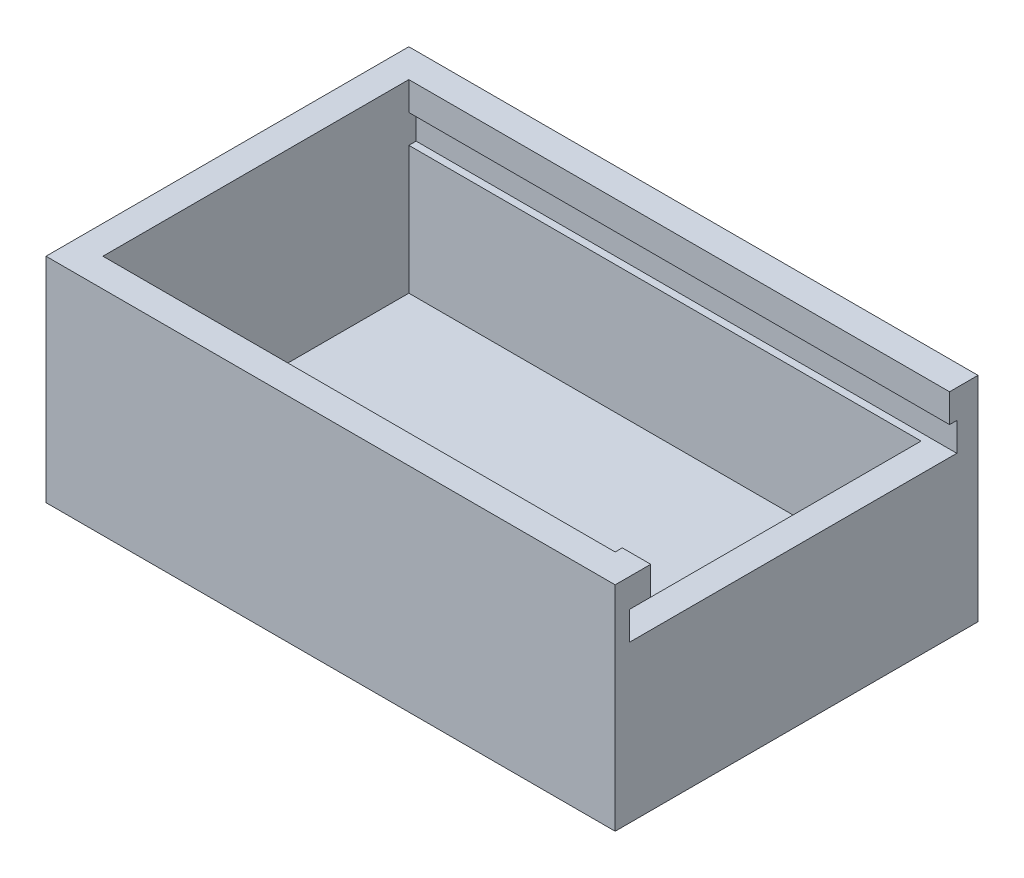
ISO-10303-21;
HEADER;
FILE_DESCRIPTION(('STEP AP214'),'2;1');
FILE_NAME('part.step','',(''),(''),'','','');
FILE_SCHEMA(('AUTOMOTIVE_DESIGN { 1 0 10303 214 1 1 1 1 }'));
ENDSEC;
DATA;
#1=APPLICATION_CONTEXT('core data for automotive mechanical design processes');
#2=APPLICATION_PROTOCOL_DEFINITION('international standard','automotive_design',2000,#1);
#3=PRODUCT_CONTEXT('',#1,'mechanical');
#4=PRODUCT('Part','Part','',(#3));
#5=PRODUCT_RELATED_PRODUCT_CATEGORY('part','',(#4));
#6=PRODUCT_DEFINITION_FORMATION('','',#4);
#7=PRODUCT_DEFINITION_CONTEXT('part definition',#1,'design');
#8=PRODUCT_DEFINITION('design','',#6,#7);
#9=PRODUCT_DEFINITION_SHAPE('','',#8);
#10=(LENGTH_UNIT() NAMED_UNIT(*) SI_UNIT(.MILLI.,.METRE.));
#11=(NAMED_UNIT(*) PLANE_ANGLE_UNIT() SI_UNIT($,.RADIAN.));
#12=(NAMED_UNIT(*) SI_UNIT($,.STERADIAN.) SOLID_ANGLE_UNIT());
#13=UNCERTAINTY_MEASURE_WITH_UNIT(LENGTH_MEASURE(1.E-05),#10,'distance_accuracy_value','');
#14=(GEOMETRIC_REPRESENTATION_CONTEXT(3) GLOBAL_UNCERTAINTY_ASSIGNED_CONTEXT((#13)) GLOBAL_UNIT_ASSIGNED_CONTEXT((#10,
#11,#12)) REPRESENTATION_CONTEXT('',''));
#15=CARTESIAN_POINT('',(0.,0.,0.));
#16=DIRECTION('',(0.,0.,1.));
#17=DIRECTION('',(1.,0.,0.));
#18=AXIS2_PLACEMENT_3D('',#15,#16,#17);
#19=CARTESIAN_POINT('',(18.,15.,12.75));
#20=DIRECTION('',(-1.,0.,0.));
#21=DIRECTION('',(0.,0.,1.));
#22=AXIS2_PLACEMENT_3D('',#19,#20,#21);
#23=PLANE('',#22);
#24=DIRECTION('',(0.,0.,-1.));
#25=VECTOR('',#24,1.);
#26=CARTESIAN_POINT('',(18.,13.,12.75));
#27=LINE('',#26,#25);
#28=CARTESIAN_POINT('',(18.,13.,10.75));
#29=VERTEX_POINT('',#28);
#30=CARTESIAN_POINT('',(18.,13.,10.25));
#31=VERTEX_POINT('',#30);
#32=EDGE_CURVE('E59',#29,#31,#27,.T.);
#33=ORIENTED_EDGE('',*,*,#32,.F.);
#34=DIRECTION('',(0.,-1.,0.));
#35=VECTOR('',#34,1.);
#36=CARTESIAN_POINT('',(18.,15.,10.75));
#37=LINE('',#36,#35);
#38=CARTESIAN_POINT('',(18.,15.,10.75));
#39=VERTEX_POINT('',#38);
#40=EDGE_CURVE('E244',#39,#29,#37,.T.);
#41=ORIENTED_EDGE('',*,*,#40,.F.);
#42=DIRECTION('',(0.,0.,-1.));
#43=VECTOR('',#42,1.);
#44=CARTESIAN_POINT('',(18.,15.,0.));
#45=LINE('',#44,#43);
#46=CARTESIAN_POINT('',(18.,15.,10.25));
#47=VERTEX_POINT('',#46);
#48=EDGE_CURVE('E257',#39,#47,#45,.T.);
#49=ORIENTED_EDGE('',*,*,#48,.T.);
#50=DIRECTION('',(0.,-1.,0.));
#51=VECTOR('',#50,1.);
#52=CARTESIAN_POINT('',(18.,15.,10.25));
#53=LINE('',#52,#51);
#54=EDGE_CURVE('E222',#47,#31,#53,.T.);
#55=ORIENTED_EDGE('',*,*,#54,.T.);
#56=EDGE_LOOP('',(#33,#41,#49,#55));
#57=FACE_BOUND('',#56,.T.);
#58=ADVANCED_FACE('F43',(#57),#23,.T.);
#59=CARTESIAN_POINT('',(20.,15.,12.75));
#60=DIRECTION('',(-1.,0.,0.));
#61=DIRECTION('',(0.,0.,1.));
#62=AXIS2_PLACEMENT_3D('',#59,#60,#61);
#63=PLANE('',#62);
#64=DIRECTION('',(0.,1.,0.));
#65=VECTOR('',#64,1.);
#66=CARTESIAN_POINT('',(20.,11.,-11.26));
#67=LINE('',#66,#65);
#68=CARTESIAN_POINT('',(20.,11.,-11.26));
#69=VERTEX_POINT('',#68);
#70=CARTESIAN_POINT('',(20.,13.,-11.26));
#71=VERTEX_POINT('',#70);
#72=EDGE_CURVE('E204',#69,#71,#67,.T.);
#73=ORIENTED_EDGE('',*,*,#72,.F.);
#74=DIRECTION('',(0.,0.,-1.));
#75=VECTOR('',#74,1.);
#76=CARTESIAN_POINT('',(20.,11.,10.25));
#77=LINE('',#76,#75);
#78=CARTESIAN_POINT('',(20.,11.,11.75));
#79=VERTEX_POINT('',#78);
#80=EDGE_CURVE('E233',#79,#69,#77,.T.);
#81=ORIENTED_EDGE('',*,*,#80,.F.);
#82=DIRECTION('',(0.,-1.,0.));
#83=VECTOR('',#82,1.);
#84=CARTESIAN_POINT('',(20.,11.,11.75));
#85=LINE('',#84,#83);
#86=CARTESIAN_POINT('',(20.,13.,11.75));
#87=VERTEX_POINT('',#86);
#88=EDGE_CURVE('E178',#87,#79,#85,.T.);
#89=ORIENTED_EDGE('',*,*,#88,.F.);
#90=DIRECTION('',(0.,0.,1.));
#91=VECTOR('',#90,1.);
#92=CARTESIAN_POINT('',(20.,13.,11.75));
#93=LINE('',#92,#91);
#94=CARTESIAN_POINT('',(20.,13.,10.25));
#95=VERTEX_POINT('',#94);
#96=EDGE_CURVE('E198',#95,#87,#93,.T.);
#97=ORIENTED_EDGE('',*,*,#96,.F.);
#98=DIRECTION('',(0.,-1.,0.));
#99=VECTOR('',#98,1.);
#100=CARTESIAN_POINT('',(20.,15.,10.25));
#101=LINE('',#100,#99);
#102=CARTESIAN_POINT('',(20.,15.,10.25));
#103=VERTEX_POINT('',#102);
#104=EDGE_CURVE('E219',#103,#95,#101,.T.);
#105=ORIENTED_EDGE('',*,*,#104,.F.);
#106=DIRECTION('',(0.,0.,-1.));
#107=VECTOR('',#106,1.);
#108=CARTESIAN_POINT('',(20.,15.,12.75));
#109=LINE('',#108,#107);
#110=CARTESIAN_POINT('',(20.,15.,12.75));
#111=VERTEX_POINT('',#110);
#112=EDGE_CURVE('E267',#111,#103,#109,.T.);
#113=ORIENTED_EDGE('',*,*,#112,.F.);
#114=DIRECTION('',(0.,-1.,0.));
#115=VECTOR('',#114,1.);
#116=CARTESIAN_POINT('',(20.,15.,12.75));
#117=LINE('',#116,#115);
#118=CARTESIAN_POINT('',(20.,0.,12.75));
#119=VERTEX_POINT('',#118);
#120=EDGE_CURVE('E276',#111,#119,#117,.T.);
#121=ORIENTED_EDGE('',*,*,#120,.T.);
#122=DIRECTION('',(0.,0.,-1.));
#123=VECTOR('',#122,1.);
#124=CARTESIAN_POINT('',(20.,0.,12.75));
#125=LINE('',#124,#123);
#126=CARTESIAN_POINT('',(20.,0.,-12.75));
#127=VERTEX_POINT('',#126);
#128=EDGE_CURVE('E241',#119,#127,#125,.T.);
#129=ORIENTED_EDGE('',*,*,#128,.T.);
#130=DIRECTION('',(0.,-1.,0.));
#131=VECTOR('',#130,1.);
#132=CARTESIAN_POINT('',(20.,15.,-12.75));
#133=LINE('',#132,#131);
#134=CARTESIAN_POINT('',(20.,15.,-12.75));
#135=VERTEX_POINT('',#134);
#136=EDGE_CURVE('E296',#135,#127,#133,.T.);
#137=ORIENTED_EDGE('',*,*,#136,.F.);
#138=CARTESIAN_POINT('',(20.,15.,-10.75));
#139=VERTEX_POINT('',#138);
#140=EDGE_CURVE('E272',#139,#135,#109,.T.);
#141=ORIENTED_EDGE('',*,*,#140,.F.);
#142=DIRECTION('',(0.,1.,0.));
#143=VECTOR('',#142,1.);
#144=CARTESIAN_POINT('',(20.,15.,-10.75));
#145=LINE('',#144,#143);
#146=CARTESIAN_POINT('',(20.,13.,-10.75));
#147=VERTEX_POINT('',#146);
#148=EDGE_CURVE('E223',#147,#139,#145,.T.);
#149=ORIENTED_EDGE('',*,*,#148,.F.);
#150=EDGE_CURVE('E194',#71,#147,#93,.T.);
#151=ORIENTED_EDGE('',*,*,#150,.F.);
#152=EDGE_LOOP('',(#73,#81,#89,#97,#105,#113,#121,#129,#137,#141,#149,#151));
#153=FACE_BOUND('',#152,.T.);
#154=ADVANCED_FACE('F44',(#153),#63,.F.);
#155=CARTESIAN_POINT('',(-20.,15.,-10.75));
#156=DIRECTION('',(0.,0.,1.));
#157=DIRECTION('',(1.,0.,0.));
#158=AXIS2_PLACEMENT_3D('',#155,#156,#157);
#159=PLANE('',#158);
#160=DIRECTION('',(-1.,0.,0.));
#161=VECTOR('',#160,1.);
#162=CARTESIAN_POINT('',(-20.,13.,-10.75));
#163=LINE('',#162,#161);
#164=CARTESIAN_POINT('',(-18.,13.,-10.75));
#165=VERTEX_POINT('',#164);
#166=EDGE_CURVE('E216',#147,#165,#163,.T.);
#167=ORIENTED_EDGE('',*,*,#166,.F.);
#168=ORIENTED_EDGE('',*,*,#148,.T.);
#169=DIRECTION('',(-1.,0.,0.));
#170=VECTOR('',#169,1.);
#171=CARTESIAN_POINT('',(0.,15.,-10.75));
#172=LINE('',#171,#170);
#173=CARTESIAN_POINT('',(-18.,15.,-10.75));
#174=VERTEX_POINT('',#173);
#175=EDGE_CURVE('E263',#139,#174,#172,.T.);
#176=ORIENTED_EDGE('',*,*,#175,.T.);
#177=DIRECTION('',(0.,-1.,0.));
#178=VECTOR('',#177,1.);
#179=CARTESIAN_POINT('',(-18.,15.,-10.75));
#180=LINE('',#179,#178);
#181=EDGE_CURVE('E242',#174,#165,#180,.T.);
#182=ORIENTED_EDGE('',*,*,#181,.T.);
#183=EDGE_LOOP('',(#167,#168,#176,#182));
#184=FACE_BOUND('',#183,.T.);
#185=ADVANCED_FACE('F349',(#184),#159,.T.);
#186=CARTESIAN_POINT('',(-20.,15.,10.75));
#187=DIRECTION('',(0.,0.,-1.));
#188=DIRECTION('',(-1.,0.,0.));
#189=AXIS2_PLACEMENT_3D('',#186,#187,#188);
#190=PLANE('',#189);
#191=DIRECTION('',(1.,0.,0.));
#192=VECTOR('',#191,1.);
#193=CARTESIAN_POINT('',(-20.,13.,10.75));
#194=LINE('',#193,#192);
#195=CARTESIAN_POINT('',(-18.,13.,10.75));
#196=VERTEX_POINT('',#195);
#197=EDGE_CURVE('E212',#196,#29,#194,.T.);
#198=ORIENTED_EDGE('',*,*,#197,.F.);
#199=DIRECTION('',(0.,-1.,0.));
#200=VECTOR('',#199,1.);
#201=CARTESIAN_POINT('',(-18.,15.,10.75));
#202=LINE('',#201,#200);
#203=CARTESIAN_POINT('',(-18.,15.,10.75));
#204=VERTEX_POINT('',#203);
#205=EDGE_CURVE('E68',#204,#196,#202,.T.);
#206=ORIENTED_EDGE('',*,*,#205,.F.);
#207=DIRECTION('',(1.,0.,0.));
#208=VECTOR('',#207,1.);
#209=CARTESIAN_POINT('',(0.,15.,10.75));
#210=LINE('',#209,#208);
#211=EDGE_CURVE('E270',#204,#39,#210,.T.);
#212=ORIENTED_EDGE('',*,*,#211,.T.);
#213=ORIENTED_EDGE('',*,*,#40,.T.);
#214=EDGE_LOOP('',(#198,#206,#212,#213));
#215=FACE_BOUND('',#214,.T.);
#216=ADVANCED_FACE('F312',(#215),#190,.T.);
#217=CARTESIAN_POINT('',(18.,11.,10.75));
#218=VERTEX_POINT('',#217);
#219=CARTESIAN_POINT('',(18.,2.,10.75));
#220=VERTEX_POINT('',#219);
#221=EDGE_CURVE('E250',#218,#220,#37,.T.);
#222=ORIENTED_EDGE('',*,*,#221,.F.);
#223=DIRECTION('',(0.,0.,-1.));
#224=VECTOR('',#223,1.);
#225=CARTESIAN_POINT('',(18.,11.,10.25));
#226=LINE('',#225,#224);
#227=CARTESIAN_POINT('',(18.,11.,-10.75));
#228=VERTEX_POINT('',#227);
#229=EDGE_CURVE('E221',#218,#228,#226,.T.);
#230=ORIENTED_EDGE('',*,*,#229,.T.);
#231=DIRECTION('',(0.,-1.,0.));
#232=VECTOR('',#231,1.);
#233=CARTESIAN_POINT('',(18.,15.,-10.75));
#234=LINE('',#233,#232);
#235=CARTESIAN_POINT('',(18.,2.,-10.75));
#236=VERTEX_POINT('',#235);
#237=EDGE_CURVE('E239',#228,#236,#234,.T.);
#238=ORIENTED_EDGE('',*,*,#237,.T.);
#239=DIRECTION('',(0.,0.,-1.));
#240=VECTOR('',#239,1.);
#241=CARTESIAN_POINT('',(18.,2.,0.));
#242=LINE('',#241,#240);
#243=EDGE_CURVE('E232',#220,#236,#242,.T.);
#244=ORIENTED_EDGE('',*,*,#243,.F.);
#245=EDGE_LOOP('',(#222,#230,#238,#244));
#246=FACE_BOUND('',#245,.T.);
#247=ADVANCED_FACE('F353',(#246),#23,.T.);
#248=CARTESIAN_POINT('',(0.,15.,0.));
#249=DIRECTION('',(0.,-1.,0.));
#250=DIRECTION('',(0.,0.,-1.));
#251=AXIS2_PLACEMENT_3D('',#248,#249,#250);
#252=PLANE('',#251);
#253=ORIENTED_EDGE('',*,*,#175,.F.);
#254=ORIENTED_EDGE('',*,*,#140,.T.);
#255=DIRECTION('',(-1.,0.,0.));
#256=VECTOR('',#255,1.);
#257=CARTESIAN_POINT('',(-20.,15.,-12.75));
#258=LINE('',#257,#256);
#259=CARTESIAN_POINT('',(-20.,15.,-12.75));
#260=VERTEX_POINT('',#259);
#261=EDGE_CURVE('E275',#135,#260,#258,.T.);
#262=ORIENTED_EDGE('',*,*,#261,.T.);
#263=DIRECTION('',(0.,0.,1.));
#264=VECTOR('',#263,1.);
#265=CARTESIAN_POINT('',(-20.,15.,12.75));
#266=LINE('',#265,#264);
#267=CARTESIAN_POINT('',(-20.,15.,12.75));
#268=VERTEX_POINT('',#267);
#269=EDGE_CURVE('E274',#260,#268,#266,.T.);
#270=ORIENTED_EDGE('',*,*,#269,.T.);
#271=DIRECTION('',(1.,0.,0.));
#272=VECTOR('',#271,1.);
#273=CARTESIAN_POINT('',(-20.,15.,12.75));
#274=LINE('',#273,#272);
#275=EDGE_CURVE('E280',#268,#111,#274,.T.);
#276=ORIENTED_EDGE('',*,*,#275,.T.);
#277=ORIENTED_EDGE('',*,*,#112,.T.);
#278=DIRECTION('',(1.,0.,0.));
#279=VECTOR('',#278,1.);
#280=CARTESIAN_POINT('',(18.,15.,10.25));
#281=LINE('',#280,#279);
#282=EDGE_CURVE('E229',#47,#103,#281,.T.);
#283=ORIENTED_EDGE('',*,*,#282,.F.);
#284=ORIENTED_EDGE('',*,*,#48,.F.);
#285=ORIENTED_EDGE('',*,*,#211,.F.);
#286=DIRECTION('',(0.,0.,1.));
#287=VECTOR('',#286,1.);
#288=CARTESIAN_POINT('',(-18.,15.,0.));
#289=LINE('',#288,#287);
#290=EDGE_CURVE('E264',#174,#204,#289,.T.);
#291=ORIENTED_EDGE('',*,*,#290,.F.);
#292=EDGE_LOOP('',(#253,#254,#262,#270,#276,#277,#283,#284,#285,#291));
#293=FACE_BOUND('',#292,.T.);
#294=ADVANCED_FACE('F310',(#293),#252,.F.);
#295=CARTESIAN_POINT('',(-20.,15.,-12.75));
#296=DIRECTION('',(0.,0.,1.));
#297=DIRECTION('',(1.,0.,0.));
#298=AXIS2_PLACEMENT_3D('',#295,#296,#297);
#299=PLANE('',#298);
#300=DIRECTION('',(-1.,0.,0.));
#301=VECTOR('',#300,1.);
#302=CARTESIAN_POINT('',(-20.,0.,-12.75));
#303=LINE('',#302,#301);
#304=CARTESIAN_POINT('',(-20.,0.,-12.75));
#305=VERTEX_POINT('',#304);
#306=EDGE_CURVE('E282',#127,#305,#303,.T.);
#307=ORIENTED_EDGE('',*,*,#306,.T.);
#308=DIRECTION('',(0.,-1.,0.));
#309=VECTOR('',#308,1.);
#310=CARTESIAN_POINT('',(-20.,15.,-12.75));
#311=LINE('',#310,#309);
#312=EDGE_CURVE('E291',#260,#305,#311,.T.);
#313=ORIENTED_EDGE('',*,*,#312,.F.);
#314=ORIENTED_EDGE('',*,*,#261,.F.);
#315=ORIENTED_EDGE('',*,*,#136,.T.);
#316=EDGE_LOOP('',(#307,#313,#314,#315));
#317=FACE_BOUND('',#316,.T.);
#318=ADVANCED_FACE('F324',(#317),#299,.F.);
#319=CARTESIAN_POINT('',(-20.,15.,12.75));
#320=DIRECTION('',(1.,0.,0.));
#321=DIRECTION('',(0.,0.,-1.));
#322=AXIS2_PLACEMENT_3D('',#319,#320,#321);
#323=PLANE('',#322);
#324=DIRECTION('',(0.,0.,1.));
#325=VECTOR('',#324,1.);
#326=CARTESIAN_POINT('',(-20.,0.,12.75));
#327=LINE('',#326,#325);
#328=CARTESIAN_POINT('',(-20.,0.,12.75));
#329=VERTEX_POINT('',#328);
#330=EDGE_CURVE('E283',#305,#329,#327,.T.);
#331=ORIENTED_EDGE('',*,*,#330,.T.);
#332=DIRECTION('',(0.,-1.,0.));
#333=VECTOR('',#332,1.);
#334=CARTESIAN_POINT('',(-20.,15.,12.75));
#335=LINE('',#334,#333);
#336=EDGE_CURVE('E287',#268,#329,#335,.T.);
#337=ORIENTED_EDGE('',*,*,#336,.F.);
#338=ORIENTED_EDGE('',*,*,#269,.F.);
#339=ORIENTED_EDGE('',*,*,#312,.T.);
#340=EDGE_LOOP('',(#331,#337,#338,#339));
#341=FACE_BOUND('',#340,.T.);
#342=ADVANCED_FACE('F335',(#341),#323,.F.);
#343=CARTESIAN_POINT('',(-20.,15.,12.75));
#344=DIRECTION('',(0.,0.,-1.));
#345=DIRECTION('',(-1.,0.,0.));
#346=AXIS2_PLACEMENT_3D('',#343,#344,#345);
#347=PLANE('',#346);
#348=DIRECTION('',(1.,0.,0.));
#349=VECTOR('',#348,1.);
#350=CARTESIAN_POINT('',(-20.,0.,12.75));
#351=LINE('',#350,#349);
#352=EDGE_CURVE('E288',#329,#119,#351,.T.);
#353=ORIENTED_EDGE('',*,*,#352,.T.);
#354=ORIENTED_EDGE('',*,*,#120,.F.);
#355=ORIENTED_EDGE('',*,*,#275,.F.);
#356=ORIENTED_EDGE('',*,*,#336,.T.);
#357=EDGE_LOOP('',(#353,#354,#355,#356));
#358=FACE_BOUND('',#357,.T.);
#359=ADVANCED_FACE('F336',(#358),#347,.F.);
#360=CARTESIAN_POINT('',(0.,0.,0.));
#361=DIRECTION('',(0.,-1.,0.));
#362=DIRECTION('',(0.,0.,-1.));
#363=AXIS2_PLACEMENT_3D('',#360,#361,#362);
#364=PLANE('',#363);
#365=ORIENTED_EDGE('',*,*,#128,.F.);
#366=ORIENTED_EDGE('',*,*,#352,.F.);
#367=ORIENTED_EDGE('',*,*,#330,.F.);
#368=ORIENTED_EDGE('',*,*,#306,.F.);
#369=EDGE_LOOP('',(#365,#366,#367,#368));
#370=FACE_BOUND('',#369,.T.);
#371=ADVANCED_FACE('F339',(#370),#364,.T.);
#372=DIRECTION('',(1.,0.,0.));
#373=VECTOR('',#372,1.);
#374=CARTESIAN_POINT('',(-20.,11.,-10.75));
#375=LINE('',#374,#373);
#376=CARTESIAN_POINT('',(-18.,11.,-10.75));
#377=VERTEX_POINT('',#376);
#378=EDGE_CURVE('E217',#377,#228,#375,.T.);
#379=ORIENTED_EDGE('',*,*,#378,.F.);
#380=CARTESIAN_POINT('',(-18.,2.,-10.75));
#381=VERTEX_POINT('',#380);
#382=EDGE_CURVE('E251',#377,#381,#180,.T.);
#383=ORIENTED_EDGE('',*,*,#382,.T.);
#384=DIRECTION('',(-1.,0.,0.));
#385=VECTOR('',#384,1.);
#386=CARTESIAN_POINT('',(0.,2.,-10.75));
#387=LINE('',#386,#385);
#388=EDGE_CURVE('E236',#236,#381,#387,.T.);
#389=ORIENTED_EDGE('',*,*,#388,.F.);
#390=ORIENTED_EDGE('',*,*,#237,.F.);
#391=EDGE_LOOP('',(#379,#383,#389,#390));
#392=FACE_BOUND('',#391,.T.);
#393=ADVANCED_FACE('F340',(#392),#159,.T.);
#394=CARTESIAN_POINT('',(-18.,15.,12.75));
#395=DIRECTION('',(1.,0.,0.));
#396=DIRECTION('',(0.,0.,-1.));
#397=AXIS2_PLACEMENT_3D('',#394,#395,#396);
#398=PLANE('',#397);
#399=ORIENTED_EDGE('',*,*,#382,.F.);
#400=DIRECTION('',(0.,0.,-1.));
#401=VECTOR('',#400,1.);
#402=CARTESIAN_POINT('',(-18.,11.,11.75));
#403=LINE('',#402,#401);
#404=CARTESIAN_POINT('',(-18.,11.,-11.26));
#405=VERTEX_POINT('',#404);
#406=EDGE_CURVE('E189',#377,#405,#403,.T.);
#407=ORIENTED_EDGE('',*,*,#406,.T.);
#408=DIRECTION('',(0.,1.,0.));
#409=VECTOR('',#408,1.);
#410=CARTESIAN_POINT('',(-18.,11.,-11.26));
#411=LINE('',#410,#409);
#412=CARTESIAN_POINT('',(-18.,13.,-11.26));
#413=VERTEX_POINT('',#412);
#414=EDGE_CURVE('E187',#405,#413,#411,.T.);
#415=ORIENTED_EDGE('',*,*,#414,.T.);
#416=DIRECTION('',(0.,0.,1.));
#417=VECTOR('',#416,1.);
#418=CARTESIAN_POINT('',(-18.,13.,11.75));
#419=LINE('',#418,#417);
#420=EDGE_CURVE('E179',#413,#165,#419,.T.);
#421=ORIENTED_EDGE('',*,*,#420,.T.);
#422=ORIENTED_EDGE('',*,*,#181,.F.);
#423=ORIENTED_EDGE('',*,*,#290,.T.);
#424=ORIENTED_EDGE('',*,*,#205,.T.);
#425=CARTESIAN_POINT('',(-18.,13.,11.75));
#426=VERTEX_POINT('',#425);
#427=EDGE_CURVE('E195',#196,#426,#419,.T.);
#428=ORIENTED_EDGE('',*,*,#427,.T.);
#429=DIRECTION('',(0.,-1.,0.));
#430=VECTOR('',#429,1.);
#431=CARTESIAN_POINT('',(-18.,11.,11.75));
#432=LINE('',#431,#430);
#433=CARTESIAN_POINT('',(-18.,11.,11.75));
#434=VERTEX_POINT('',#433);
#435=EDGE_CURVE('E173',#426,#434,#432,.T.);
#436=ORIENTED_EDGE('',*,*,#435,.T.);
#437=CARTESIAN_POINT('',(-18.,11.,10.75));
#438=VERTEX_POINT('',#437);
#439=EDGE_CURVE('E185',#434,#438,#403,.T.);
#440=ORIENTED_EDGE('',*,*,#439,.T.);
#441=CARTESIAN_POINT('',(-18.,2.,10.75));
#442=VERTEX_POINT('',#441);
#443=EDGE_CURVE('E248',#438,#442,#202,.T.);
#444=ORIENTED_EDGE('',*,*,#443,.T.);
#445=DIRECTION('',(0.,0.,1.));
#446=VECTOR('',#445,1.);
#447=CARTESIAN_POINT('',(-18.,2.,0.));
#448=LINE('',#447,#446);
#449=EDGE_CURVE('E247',#381,#442,#448,.T.);
#450=ORIENTED_EDGE('',*,*,#449,.F.);
#451=EDGE_LOOP('',(#399,#407,#415,#421,#422,#423,#424,#428,#436,#440,#444,#450));
#452=FACE_BOUND('',#451,.T.);
#453=ADVANCED_FACE('F193',(#452),#398,.T.);
#454=DIRECTION('',(-1.,0.,0.));
#455=VECTOR('',#454,1.);
#456=CARTESIAN_POINT('',(-20.,11.,10.75));
#457=LINE('',#456,#455);
#458=EDGE_CURVE('E11',#218,#438,#457,.T.);
#459=ORIENTED_EDGE('',*,*,#458,.F.);
#460=ORIENTED_EDGE('',*,*,#221,.T.);
#461=DIRECTION('',(1.,0.,0.));
#462=VECTOR('',#461,1.);
#463=CARTESIAN_POINT('',(0.,2.,10.75));
#464=LINE('',#463,#462);
#465=EDGE_CURVE('E258',#442,#220,#464,.T.);
#466=ORIENTED_EDGE('',*,*,#465,.F.);
#467=ORIENTED_EDGE('',*,*,#443,.F.);
#468=EDGE_LOOP('',(#459,#460,#466,#467));
#469=FACE_BOUND('',#468,.T.);
#470=ADVANCED_FACE('F368',(#469),#190,.T.);
#471=CARTESIAN_POINT('',(0.,2.,0.));
#472=DIRECTION('',(0.,-1.,0.));
#473=DIRECTION('',(0.,0.,-1.));
#474=AXIS2_PLACEMENT_3D('',#471,#472,#473);
#475=PLANE('',#474);
#476=ORIENTED_EDGE('',*,*,#243,.T.);
#477=ORIENTED_EDGE('',*,*,#388,.T.);
#478=ORIENTED_EDGE('',*,*,#449,.T.);
#479=ORIENTED_EDGE('',*,*,#465,.T.);
#480=EDGE_LOOP('',(#476,#477,#478,#479));
#481=FACE_BOUND('',#480,.T.);
#482=ADVANCED_FACE('F373',(#481),#475,.F.);
#483=CARTESIAN_POINT('',(18.,15.,10.25));
#484=DIRECTION('',(0.,0.,1.));
#485=DIRECTION('',(1.,0.,0.));
#486=AXIS2_PLACEMENT_3D('',#483,#484,#485);
#487=PLANE('',#486);
#488=ORIENTED_EDGE('',*,*,#104,.T.);
#489=DIRECTION('',(-1.,0.,0.));
#490=VECTOR('',#489,1.);
#491=CARTESIAN_POINT('',(18.,13.,10.25));
#492=LINE('',#491,#490);
#493=EDGE_CURVE('E51',#95,#31,#492,.T.);
#494=ORIENTED_EDGE('',*,*,#493,.T.);
#495=ORIENTED_EDGE('',*,*,#54,.F.);
#496=ORIENTED_EDGE('',*,*,#282,.T.);
#497=EDGE_LOOP('',(#488,#494,#495,#496));
#498=FACE_BOUND('',#497,.T.);
#499=ADVANCED_FACE('F298',(#498),#487,.F.);
#500=CARTESIAN_POINT('',(18.,11.,10.25));
#501=DIRECTION('',(0.,-1.,0.));
#502=DIRECTION('',(0.,0.,-1.));
#503=AXIS2_PLACEMENT_3D('',#500,#501,#502);
#504=PLANE('',#503);
#505=ORIENTED_EDGE('',*,*,#80,.T.);
#506=DIRECTION('',(1.,0.,0.));
#507=VECTOR('',#506,1.);
#508=CARTESIAN_POINT('',(-18.,11.,-11.26));
#509=LINE('',#508,#507);
#510=EDGE_CURVE('E176',#405,#69,#509,.T.);
#511=ORIENTED_EDGE('',*,*,#510,.F.);
#512=ORIENTED_EDGE('',*,*,#406,.F.);
#513=ORIENTED_EDGE('',*,*,#378,.T.);
#514=ORIENTED_EDGE('',*,*,#229,.F.);
#515=ORIENTED_EDGE('',*,*,#458,.T.);
#516=ORIENTED_EDGE('',*,*,#439,.F.);
#517=DIRECTION('',(1.,0.,0.));
#518=VECTOR('',#517,1.);
#519=CARTESIAN_POINT('',(-18.,11.,11.75));
#520=LINE('',#519,#518);
#521=EDGE_CURVE('E166',#434,#79,#520,.T.);
#522=ORIENTED_EDGE('',*,*,#521,.T.);
#523=EDGE_LOOP('',(#505,#511,#512,#513,#514,#515,#516,#522));
#524=FACE_BOUND('',#523,.T.);
#525=ADVANCED_FACE('F181',(#524),#504,.F.);
#526=CARTESIAN_POINT('',(-18.,13.,11.75));
#527=DIRECTION('',(0.,1.,0.));
#528=DIRECTION('',(0.,0.,1.));
#529=AXIS2_PLACEMENT_3D('',#526,#527,#528);
#530=PLANE('',#529);
#531=ORIENTED_EDGE('',*,*,#197,.T.);
#532=ORIENTED_EDGE('',*,*,#32,.T.);
#533=ORIENTED_EDGE('',*,*,#493,.F.);
#534=ORIENTED_EDGE('',*,*,#96,.T.);
#535=DIRECTION('',(1.,0.,0.));
#536=VECTOR('',#535,1.);
#537=CARTESIAN_POINT('',(-18.,13.,11.75));
#538=LINE('',#537,#536);
#539=EDGE_CURVE('E210',#426,#87,#538,.T.);
#540=ORIENTED_EDGE('',*,*,#539,.F.);
#541=ORIENTED_EDGE('',*,*,#427,.F.);
#542=EDGE_LOOP('',(#531,#532,#533,#534,#540,#541));
#543=FACE_BOUND('',#542,.T.);
#544=ADVANCED_FACE('F314',(#543),#530,.F.);
#545=CARTESIAN_POINT('',(-18.,11.,11.75));
#546=DIRECTION('',(0.,0.,1.));
#547=DIRECTION('',(1.,0.,0.));
#548=AXIS2_PLACEMENT_3D('',#545,#546,#547);
#549=PLANE('',#548);
#550=ORIENTED_EDGE('',*,*,#88,.T.);
#551=ORIENTED_EDGE('',*,*,#521,.F.);
#552=ORIENTED_EDGE('',*,*,#435,.F.);
#553=ORIENTED_EDGE('',*,*,#539,.T.);
#554=EDGE_LOOP('',(#550,#551,#552,#553));
#555=FACE_BOUND('',#554,.T.);
#556=ADVANCED_FACE('F171',(#555),#549,.F.);
#557=ORIENTED_EDGE('',*,*,#166,.T.);
#558=ORIENTED_EDGE('',*,*,#420,.F.);
#559=DIRECTION('',(1.,0.,0.));
#560=VECTOR('',#559,1.);
#561=CARTESIAN_POINT('',(-18.,13.,-11.26));
#562=LINE('',#561,#560);
#563=EDGE_CURVE('E207',#413,#71,#562,.T.);
#564=ORIENTED_EDGE('',*,*,#563,.T.);
#565=ORIENTED_EDGE('',*,*,#150,.T.);
#566=EDGE_LOOP('',(#557,#558,#564,#565));
#567=FACE_BOUND('',#566,.T.);
#568=ADVANCED_FACE('F382',(#567),#530,.F.);
#569=CARTESIAN_POINT('',(-18.,11.,-11.26));
#570=DIRECTION('',(0.,0.,-1.));
#571=DIRECTION('',(0.,1.,0.));
#572=AXIS2_PLACEMENT_3D('',#569,#570,#571);
#573=PLANE('',#572);
#574=ORIENTED_EDGE('',*,*,#72,.T.);
#575=ORIENTED_EDGE('',*,*,#563,.F.);
#576=ORIENTED_EDGE('',*,*,#414,.F.);
#577=ORIENTED_EDGE('',*,*,#510,.T.);
#578=EDGE_LOOP('',(#574,#575,#576,#577));
#579=FACE_BOUND('',#578,.T.);
#580=ADVANCED_FACE('F379',(#579),#573,.F.);
#581=CLOSED_SHELL('',(#58,#154,#185,#216,#247,#294,#318,#342,#359,#371,#393,#453,#470,#482,#499,
#525,#544,#556,#568,#580));
#582=MANIFOLD_SOLID_BREP('B2',#581);
#583=ADVANCED_BREP_SHAPE_REPRESENTATION('',(#18,#582),#14);
#584=SHAPE_DEFINITION_REPRESENTATION(#9,#583);
ENDSEC;
END-ISO-10303-21;
